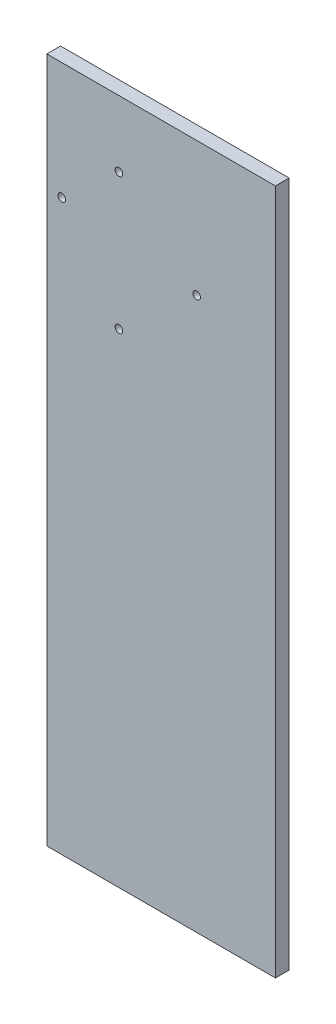
ISO-10303-21;
HEADER;
FILE_DESCRIPTION(('STEP AP214'),'2;1');
FILE_NAME('part.step','',(''),(''),'','','');
FILE_SCHEMA(('AUTOMOTIVE_DESIGN { 1 0 10303 214 1 1 1 1 }'));
ENDSEC;
DATA;
#1=APPLICATION_CONTEXT('core data for automotive mechanical design processes');
#2=APPLICATION_PROTOCOL_DEFINITION('international standard','automotive_design',2000,#1);
#3=PRODUCT_CONTEXT('',#1,'mechanical');
#4=PRODUCT('Part','Part','',(#3));
#5=PRODUCT_RELATED_PRODUCT_CATEGORY('part','',(#4));
#6=PRODUCT_DEFINITION_FORMATION('','',#4);
#7=PRODUCT_DEFINITION_CONTEXT('part definition',#1,'design');
#8=PRODUCT_DEFINITION('design','',#6,#7);
#9=PRODUCT_DEFINITION_SHAPE('','',#8);
#10=(LENGTH_UNIT() NAMED_UNIT(*) SI_UNIT(.MILLI.,.METRE.));
#11=(NAMED_UNIT(*) PLANE_ANGLE_UNIT() SI_UNIT($,.RADIAN.));
#12=(NAMED_UNIT(*) SI_UNIT($,.STERADIAN.) SOLID_ANGLE_UNIT());
#13=UNCERTAINTY_MEASURE_WITH_UNIT(LENGTH_MEASURE(1.E-05),#10,'distance_accuracy_value','');
#14=(GEOMETRIC_REPRESENTATION_CONTEXT(3) GLOBAL_UNCERTAINTY_ASSIGNED_CONTEXT((#13)) GLOBAL_UNIT_ASSIGNED_CONTEXT((#10,
#11,#12)) REPRESENTATION_CONTEXT('',''));
#15=CARTESIAN_POINT('',(0.,0.,0.));
#16=DIRECTION('',(0.,0.,1.));
#17=DIRECTION('',(1.,0.,0.));
#18=AXIS2_PLACEMENT_3D('',#15,#16,#17);
#19=CARTESIAN_POINT('',(75.0000000000001,450.,-4.50000000000001));
#20=DIRECTION('',(-1.,0.,0.));
#21=DIRECTION('',(0.,0.,1.));
#22=AXIS2_PLACEMENT_3D('',#19,#20,#21);
#23=PLANE('',#22);
#24=DIRECTION('',(0.,0.,-1.));
#25=VECTOR('',#24,1.);
#26=CARTESIAN_POINT('',(75.0000000000001,0.,-4.50000000000001));
#27=LINE('',#26,#25);
#28=CARTESIAN_POINT('',(75.0000000000001,0.,4.49999999999999));
#29=VERTEX_POINT('',#28);
#30=CARTESIAN_POINT('',(75.0000000000001,0.,-4.50000000000001));
#31=VERTEX_POINT('',#30);
#32=EDGE_CURVE('E100',#29,#31,#27,.T.);
#33=ORIENTED_EDGE('',*,*,#32,.T.);
#34=DIRECTION('',(0.,-1.,0.));
#35=VECTOR('',#34,1.);
#36=CARTESIAN_POINT('',(75.0000000000001,450.,-4.50000000000001));
#37=LINE('',#36,#35);
#38=CARTESIAN_POINT('',(75.0000000000001,450.,-4.50000000000001));
#39=VERTEX_POINT('',#38);
#40=EDGE_CURVE('E11',#39,#31,#37,.T.);
#41=ORIENTED_EDGE('',*,*,#40,.F.);
#42=DIRECTION('',(0.,0.,-1.));
#43=VECTOR('',#42,1.);
#44=CARTESIAN_POINT('',(75.0000000000001,450.,-4.50000000000001));
#45=LINE('',#44,#43);
#46=CARTESIAN_POINT('',(75.0000000000001,450.,4.49999999999999));
#47=VERTEX_POINT('',#46);
#48=EDGE_CURVE('E87',#47,#39,#45,.T.);
#49=ORIENTED_EDGE('',*,*,#48,.F.);
#50=DIRECTION('',(0.,-1.,0.));
#51=VECTOR('',#50,1.);
#52=CARTESIAN_POINT('',(75.0000000000001,450.,4.49999999999999));
#53=LINE('',#52,#51);
#54=EDGE_CURVE('E96',#47,#29,#53,.T.);
#55=ORIENTED_EDGE('',*,*,#54,.T.);
#56=EDGE_LOOP('',(#33,#41,#49,#55));
#57=FACE_BOUND('',#56,.T.);
#58=ADVANCED_FACE('F34',(#57),#23,.F.);
#59=CARTESIAN_POINT('',(-74.9999999999999,450.,-4.50000000000001));
#60=DIRECTION('',(0.,0.,1.));
#61=DIRECTION('',(1.,0.,0.));
#62=AXIS2_PLACEMENT_3D('',#59,#60,#61);
#63=PLANE('',#62);
#64=CARTESIAN_POINT('',(-27.7,406.6,-4.50000000000001));
#65=DIRECTION('',(0.,0.,1.));
#66=DIRECTION('',(1.,0.,0.));
#67=AXIS2_PLACEMENT_3D('',#64,#65,#66);
#68=CIRCLE('',#67,2.5);
#69=CARTESIAN_POINT('',(-30.2,406.6,-4.50000000000001));
#70=VERTEX_POINT('',#69);
#71=EDGE_CURVE('E112',#70,#70,#68,.F.);
#72=ORIENTED_EDGE('',*,*,#71,.F.);
#73=EDGE_LOOP('',(#72));
#74=FACE_BOUND('',#73,.T.);
#75=CARTESIAN_POINT('',(-27.7,317.4,-4.50000000000001));
#76=DIRECTION('',(0.,0.,1.));
#77=DIRECTION('',(1.,0.,0.));
#78=AXIS2_PLACEMENT_3D('',#75,#76,#77);
#79=CIRCLE('',#78,2.5);
#80=CARTESIAN_POINT('',(-30.2,317.4,-4.50000000000001));
#81=VERTEX_POINT('',#80);
#82=EDGE_CURVE('E162',#81,#81,#79,.F.);
#83=ORIENTED_EDGE('',*,*,#82,.F.);
#84=EDGE_LOOP('',(#83));
#85=FACE_BOUND('',#84,.T.);
#86=CARTESIAN_POINT('',(23.3,362.,-4.50000000000001));
#87=DIRECTION('',(0.,0.,1.));
#88=DIRECTION('',(1.,0.,0.));
#89=AXIS2_PLACEMENT_3D('',#86,#87,#88);
#90=CIRCLE('',#89,2.5);
#91=CARTESIAN_POINT('',(20.8,362.,-4.50000000000001));
#92=VERTEX_POINT('',#91);
#93=EDGE_CURVE('E159',#92,#92,#90,.F.);
#94=ORIENTED_EDGE('',*,*,#93,.F.);
#95=EDGE_LOOP('',(#94));
#96=FACE_BOUND('',#95,.T.);
#97=CARTESIAN_POINT('',(-65.1999999999999,373.3,-4.50000000000001));
#98=DIRECTION('',(0.,0.,1.));
#99=DIRECTION('',(1.,0.,0.));
#100=AXIS2_PLACEMENT_3D('',#97,#98,#99);
#101=CIRCLE('',#100,2.5);
#102=CARTESIAN_POINT('',(-67.7,373.3,-4.50000000000001));
#103=VERTEX_POINT('',#102);
#104=EDGE_CURVE('E157',#103,#103,#101,.F.);
#105=ORIENTED_EDGE('',*,*,#104,.F.);
#106=EDGE_LOOP('',(#105));
#107=FACE_BOUND('',#106,.T.);
#108=DIRECTION('',(-1.,0.,0.));
#109=VECTOR('',#108,1.);
#110=CARTESIAN_POINT('',(-74.9999999999999,0.,-4.50000000000001));
#111=LINE('',#110,#109);
#112=CARTESIAN_POINT('',(-74.9999999999999,0.,-4.50000000000001));
#113=VERTEX_POINT('',#112);
#114=EDGE_CURVE('E91',#31,#113,#111,.T.);
#115=ORIENTED_EDGE('',*,*,#114,.T.);
#116=DIRECTION('',(0.,-1.,0.));
#117=VECTOR('',#116,1.);
#118=CARTESIAN_POINT('',(-74.9999999999999,450.,-4.50000000000001));
#119=LINE('',#118,#117);
#120=CARTESIAN_POINT('',(-74.9999999999999,450.,-4.50000000000001));
#121=VERTEX_POINT('',#120);
#122=EDGE_CURVE('E43',#121,#113,#119,.T.);
#123=ORIENTED_EDGE('',*,*,#122,.F.);
#124=DIRECTION('',(-1.,0.,0.));
#125=VECTOR('',#124,1.);
#126=CARTESIAN_POINT('',(-74.9999999999999,450.,-4.50000000000001));
#127=LINE('',#126,#125);
#128=EDGE_CURVE('E82',#39,#121,#127,.T.);
#129=ORIENTED_EDGE('',*,*,#128,.F.);
#130=ORIENTED_EDGE('',*,*,#40,.T.);
#131=EDGE_LOOP('',(#115,#123,#129,#130));
#132=FACE_BOUND('',#131,.T.);
#133=ADVANCED_FACE('F90',(#74,#85,#96,#107,#132),#63,.F.);
#134=CARTESIAN_POINT('',(-74.9999999999999,450.,-4.50000000000001));
#135=DIRECTION('',(1.,0.,0.));
#136=DIRECTION('',(0.,0.,-1.));
#137=AXIS2_PLACEMENT_3D('',#134,#135,#136);
#138=PLANE('',#137);
#139=DIRECTION('',(0.,0.,1.));
#140=VECTOR('',#139,1.);
#141=CARTESIAN_POINT('',(-74.9999999999999,0.,-4.50000000000001));
#142=LINE('',#141,#140);
#143=CARTESIAN_POINT('',(-75.,0.,4.49999999999999));
#144=VERTEX_POINT('',#143);
#145=EDGE_CURVE('E69',#113,#144,#142,.T.);
#146=ORIENTED_EDGE('',*,*,#145,.T.);
#147=DIRECTION('',(0.,-1.,0.));
#148=VECTOR('',#147,1.);
#149=CARTESIAN_POINT('',(-75.,450.,4.49999999999999));
#150=LINE('',#149,#148);
#151=CARTESIAN_POINT('',(-75.,450.,4.49999999999999));
#152=VERTEX_POINT('',#151);
#153=EDGE_CURVE('E92',#152,#144,#150,.T.);
#154=ORIENTED_EDGE('',*,*,#153,.F.);
#155=DIRECTION('',(0.,0.,1.));
#156=VECTOR('',#155,1.);
#157=CARTESIAN_POINT('',(-74.9999999999999,450.,-4.50000000000001));
#158=LINE('',#157,#156);
#159=EDGE_CURVE('E85',#121,#152,#158,.T.);
#160=ORIENTED_EDGE('',*,*,#159,.F.);
#161=ORIENTED_EDGE('',*,*,#122,.T.);
#162=EDGE_LOOP('',(#146,#154,#160,#161));
#163=FACE_BOUND('',#162,.T.);
#164=ADVANCED_FACE('F94',(#163),#138,.F.);
#165=CARTESIAN_POINT('',(-75.,450.,4.49999999999999));
#166=DIRECTION('',(0.,0.,-1.));
#167=DIRECTION('',(-1.,0.,0.));
#168=AXIS2_PLACEMENT_3D('',#165,#166,#167);
#169=PLANE('',#168);
#170=CARTESIAN_POINT('',(-27.7,406.6,4.49999999999999));
#171=DIRECTION('',(0.,0.,-1.));
#172=DIRECTION('',(-1.,0.,0.));
#173=AXIS2_PLACEMENT_3D('',#170,#171,#172);
#174=CIRCLE('',#173,2.5);
#175=CARTESIAN_POINT('',(-30.2,406.6,4.49999999999999));
#176=VERTEX_POINT('',#175);
#177=EDGE_CURVE('E37',#176,#176,#174,.F.);
#178=ORIENTED_EDGE('',*,*,#177,.F.);
#179=EDGE_LOOP('',(#178));
#180=FACE_BOUND('',#179,.T.);
#181=CARTESIAN_POINT('',(-27.7,317.4,4.49999999999999));
#182=DIRECTION('',(0.,0.,-1.));
#183=DIRECTION('',(-1.,0.,0.));
#184=AXIS2_PLACEMENT_3D('',#181,#182,#183);
#185=CIRCLE('',#184,2.5);
#186=CARTESIAN_POINT('',(-30.2,317.4,4.49999999999999));
#187=VERTEX_POINT('',#186);
#188=EDGE_CURVE('E114',#187,#187,#185,.F.);
#189=ORIENTED_EDGE('',*,*,#188,.F.);
#190=EDGE_LOOP('',(#189));
#191=FACE_BOUND('',#190,.T.);
#192=CARTESIAN_POINT('',(23.3,362.,4.49999999999999));
#193=DIRECTION('',(0.,0.,-1.));
#194=DIRECTION('',(-1.,0.,0.));
#195=AXIS2_PLACEMENT_3D('',#192,#193,#194);
#196=CIRCLE('',#195,2.5);
#197=CARTESIAN_POINT('',(20.8,362.,4.49999999999999));
#198=VERTEX_POINT('',#197);
#199=EDGE_CURVE('E111',#198,#198,#196,.F.);
#200=ORIENTED_EDGE('',*,*,#199,.F.);
#201=EDGE_LOOP('',(#200));
#202=FACE_BOUND('',#201,.T.);
#203=CARTESIAN_POINT('',(-65.1999999999999,373.3,4.49999999999999));
#204=DIRECTION('',(0.,0.,-1.));
#205=DIRECTION('',(-1.,0.,0.));
#206=AXIS2_PLACEMENT_3D('',#203,#204,#205);
#207=CIRCLE('',#206,2.5);
#208=CARTESIAN_POINT('',(-67.7,373.3,4.49999999999999));
#209=VERTEX_POINT('',#208);
#210=EDGE_CURVE('E108',#209,#209,#207,.F.);
#211=ORIENTED_EDGE('',*,*,#210,.F.);
#212=EDGE_LOOP('',(#211));
#213=FACE_BOUND('',#212,.T.);
#214=DIRECTION('',(1.,0.,0.));
#215=VECTOR('',#214,1.);
#216=CARTESIAN_POINT('',(-75.,0.,4.49999999999999));
#217=LINE('',#216,#215);
#218=EDGE_CURVE('E75',#144,#29,#217,.T.);
#219=ORIENTED_EDGE('',*,*,#218,.T.);
#220=ORIENTED_EDGE('',*,*,#54,.F.);
#221=DIRECTION('',(1.,0.,0.));
#222=VECTOR('',#221,1.);
#223=CARTESIAN_POINT('',(-75.,450.,4.49999999999999));
#224=LINE('',#223,#222);
#225=EDGE_CURVE('E52',#152,#47,#224,.T.);
#226=ORIENTED_EDGE('',*,*,#225,.F.);
#227=ORIENTED_EDGE('',*,*,#153,.T.);
#228=EDGE_LOOP('',(#219,#220,#226,#227));
#229=FACE_BOUND('',#228,.T.);
#230=ADVANCED_FACE('F123',(#180,#191,#202,#213,#229),#169,.F.);
#231=CARTESIAN_POINT('',(0.,450.,0.));
#232=DIRECTION('',(0.,1.,0.));
#233=DIRECTION('',(0.,0.,1.));
#234=AXIS2_PLACEMENT_3D('',#231,#232,#233);
#235=PLANE('',#234);
#236=ORIENTED_EDGE('',*,*,#48,.T.);
#237=ORIENTED_EDGE('',*,*,#128,.T.);
#238=ORIENTED_EDGE('',*,*,#159,.T.);
#239=ORIENTED_EDGE('',*,*,#225,.T.);
#240=EDGE_LOOP('',(#236,#237,#238,#239));
#241=FACE_BOUND('',#240,.T.);
#242=ADVANCED_FACE('F83',(#241),#235,.T.);
#243=CARTESIAN_POINT('',(0.,0.,0.));
#244=DIRECTION('',(0.,1.,0.));
#245=DIRECTION('',(0.,0.,1.));
#246=AXIS2_PLACEMENT_3D('',#243,#244,#245);
#247=PLANE('',#246);
#248=ORIENTED_EDGE('',*,*,#32,.F.);
#249=ORIENTED_EDGE('',*,*,#218,.F.);
#250=ORIENTED_EDGE('',*,*,#145,.F.);
#251=ORIENTED_EDGE('',*,*,#114,.F.);
#252=EDGE_LOOP('',(#248,#249,#250,#251));
#253=FACE_BOUND('',#252,.T.);
#254=ADVANCED_FACE('F135',(#253),#247,.F.);
#255=CARTESIAN_POINT('',(-65.1999999999999,373.3,4.50001199999999));
#256=DIRECTION('',(0.,0.,-1.));
#257=DIRECTION('',(-1.,0.,0.));
#258=AXIS2_PLACEMENT_3D('',#255,#256,#257);
#259=CYLINDRICAL_SURFACE('',#258,2.5);
#260=CARTESIAN_POINT('',(-67.7,373.3,-4.50000000000001));
#261=CARTESIAN_POINT('',(-67.7,373.3,-4.40625000000001));
#262=CARTESIAN_POINT('',(-67.7,373.3,-4.31250000000001));
#263=CARTESIAN_POINT('',(-67.7,373.3,-4.12500000000001));
#264=CARTESIAN_POINT('',(-67.7,373.3,-4.03125000000001));
#265=CARTESIAN_POINT('',(-67.7,373.3,-3.84375000000001));
#266=CARTESIAN_POINT('',(-67.7,373.3,-3.75000000000001));
#267=CARTESIAN_POINT('',(-67.7,373.3,-3.56250000000001));
#268=CARTESIAN_POINT('',(-67.7,373.3,-3.46875000000001));
#269=CARTESIAN_POINT('',(-67.7,373.3,-3.28125000000001));
#270=CARTESIAN_POINT('',(-67.7,373.3,-3.18750000000001));
#271=CARTESIAN_POINT('',(-67.7,373.3,-3.00000000000001));
#272=CARTESIAN_POINT('',(-67.7,373.3,-2.90625000000001));
#273=CARTESIAN_POINT('',(-67.7,373.3,-2.71875000000001));
#274=CARTESIAN_POINT('',(-67.7,373.3,-2.62500000000001));
#275=CARTESIAN_POINT('',(-67.7,373.3,-2.43750000000001));
#276=CARTESIAN_POINT('',(-67.7,373.3,-2.34375000000001));
#277=CARTESIAN_POINT('',(-67.7,373.3,-2.15625000000001));
#278=CARTESIAN_POINT('',(-67.7,373.3,-2.06250000000001));
#279=CARTESIAN_POINT('',(-67.7,373.3,-1.87500000000001));
#280=CARTESIAN_POINT('',(-67.7,373.3,-1.78125000000001));
#281=CARTESIAN_POINT('',(-67.7,373.3,-1.59375000000001));
#282=CARTESIAN_POINT('',(-67.7,373.3,-1.50000000000001));
#283=CARTESIAN_POINT('',(-67.7,373.3,-1.31250000000001));
#284=CARTESIAN_POINT('',(-67.7,373.3,-1.21875000000001));
#285=CARTESIAN_POINT('',(-67.7,373.3,-1.03125000000001));
#286=CARTESIAN_POINT('',(-67.7,373.3,-0.937500000000006));
#287=CARTESIAN_POINT('',(-67.7,373.3,-0.750000000000006));
#288=CARTESIAN_POINT('',(-67.7,373.3,-0.656250000000006));
#289=CARTESIAN_POINT('',(-67.7,373.3,-0.468750000000006));
#290=CARTESIAN_POINT('',(-67.7,373.3,-0.375000000000006));
#291=CARTESIAN_POINT('',(-67.7,373.3,-0.187500000000006));
#292=CARTESIAN_POINT('',(-67.7,373.3,-0.0937500000000062));
#293=CARTESIAN_POINT('',(-67.7,373.3,0.093749999999994));
#294=CARTESIAN_POINT('',(-67.7,373.3,0.187499999999994));
#295=CARTESIAN_POINT('',(-67.7,373.3,0.374999999999994));
#296=CARTESIAN_POINT('',(-67.7,373.3,0.468749999999994));
#297=CARTESIAN_POINT('',(-67.7,373.3,0.656249999999994));
#298=CARTESIAN_POINT('',(-67.7,373.3,0.749999999999994));
#299=CARTESIAN_POINT('',(-67.7,373.3,0.937499999999993));
#300=CARTESIAN_POINT('',(-67.7,373.3,1.03124999999999));
#301=CARTESIAN_POINT('',(-67.7,373.3,1.21874999999999));
#302=CARTESIAN_POINT('',(-67.7,373.3,1.31249999999999));
#303=CARTESIAN_POINT('',(-67.7,373.3,1.49999999999999));
#304=CARTESIAN_POINT('',(-67.7,373.3,1.59374999999999));
#305=CARTESIAN_POINT('',(-67.7,373.3,1.78124999999999));
#306=CARTESIAN_POINT('',(-67.7,373.3,1.87499999999999));
#307=CARTESIAN_POINT('',(-67.7,373.3,2.06249999999999));
#308=CARTESIAN_POINT('',(-67.7,373.3,2.15624999999999));
#309=CARTESIAN_POINT('',(-67.7,373.3,2.34374999999999));
#310=CARTESIAN_POINT('',(-67.7,373.3,2.43749999999999));
#311=CARTESIAN_POINT('',(-67.7,373.3,2.62499999999999));
#312=CARTESIAN_POINT('',(-67.7,373.3,2.71874999999999));
#313=CARTESIAN_POINT('',(-67.7,373.3,2.90624999999999));
#314=CARTESIAN_POINT('',(-67.7,373.3,2.99999999999999));
#315=CARTESIAN_POINT('',(-67.7,373.3,3.18749999999999));
#316=CARTESIAN_POINT('',(-67.7,373.3,3.28124999999999));
#317=CARTESIAN_POINT('',(-67.7,373.3,3.46874999999999));
#318=CARTESIAN_POINT('',(-67.7,373.3,3.56249999999999));
#319=CARTESIAN_POINT('',(-67.7,373.3,3.74999999999999));
#320=CARTESIAN_POINT('',(-67.7,373.3,3.84374999999999));
#321=CARTESIAN_POINT('',(-67.7,373.3,4.03124999999999));
#322=CARTESIAN_POINT('',(-67.7,373.3,4.12499999999999));
#323=CARTESIAN_POINT('',(-67.7,373.3,4.31249999999999));
#324=CARTESIAN_POINT('',(-67.7,373.3,4.40624999999999));
#325=CARTESIAN_POINT('',(-67.7,373.3,4.49999999999999));
#326=B_SPLINE_CURVE_WITH_KNOTS('',3,(#260,#261,#262,#263,#264,#265,#266,#267,#268,#269,#270,
#271,#272,#273,#274,#275,#276,#277,#278,#279,#280,#281,#282,#283,#284,#285,#286,#287,#288,#289,
#290,#291,#292,#293,#294,#295,#296,#297,#298,#299,#300,#301,#302,#303,#304,#305,#306,#307,#308,
#309,#310,#311,#312,#313,#314,#315,#316,#317,#318,#319,#320,#321,#322,#323,#324,#325),
.UNSPECIFIED.,.F.,.F.,(4,2,2,2,2,2,2,2,2,2,2,2,2,2,2,2,2,2,2,2,2,2,2,2,2,2,2,2,2,2,2,2,4),(0.,
0.28125,0.5625,0.843750000000001,1.125,1.40625,1.6875,1.96875,2.25,2.53125,2.8125,3.09375,3.375,
3.65625,3.9375,4.21875,4.5,4.78125,5.0625,5.34375,5.625,5.90625,6.1875,6.46875,6.75,7.03125,
7.3125,7.59375,7.875,8.15625,8.4375,8.71875,9.),.UNSPECIFIED.);
#327=EDGE_CURVE('BSEAM132',#103,#209,#326,.T.);
#328=ORIENTED_EDGE('',*,*,#104,.T.);
#329=ORIENTED_EDGE('',*,*,#210,.T.);
#330=ORIENTED_EDGE('',*,*,#327,.T.);
#331=ORIENTED_EDGE('',*,*,#327,.F.);
#332=EDGE_LOOP('',(#328,#330,#329,#331));
#333=FACE_BOUND('',#332,.T.);
#334=ADVANCED_FACE('F132',(#333),#259,.F.);
#335=CARTESIAN_POINT('',(23.3,362.,4.50001199999999));
#336=DIRECTION('',(0.,0.,-1.));
#337=DIRECTION('',(-1.,0.,0.));
#338=AXIS2_PLACEMENT_3D('',#335,#336,#337);
#339=CYLINDRICAL_SURFACE('',#338,2.5);
#340=CARTESIAN_POINT('',(20.8,362.,-4.50000000000001));
#341=CARTESIAN_POINT('',(20.8,362.,-4.40625000000001));
#342=CARTESIAN_POINT('',(20.8,362.,-4.31250000000001));
#343=CARTESIAN_POINT('',(20.8,362.,-4.12500000000001));
#344=CARTESIAN_POINT('',(20.8,362.,-4.03125000000001));
#345=CARTESIAN_POINT('',(20.8,362.,-3.84375000000001));
#346=CARTESIAN_POINT('',(20.8,362.,-3.75000000000001));
#347=CARTESIAN_POINT('',(20.8,362.,-3.56250000000001));
#348=CARTESIAN_POINT('',(20.8,362.,-3.46875000000001));
#349=CARTESIAN_POINT('',(20.8,362.,-3.28125000000001));
#350=CARTESIAN_POINT('',(20.8,362.,-3.18750000000001));
#351=CARTESIAN_POINT('',(20.8,362.,-3.00000000000001));
#352=CARTESIAN_POINT('',(20.8,362.,-2.90625000000001));
#353=CARTESIAN_POINT('',(20.8,362.,-2.71875000000001));
#354=CARTESIAN_POINT('',(20.8,362.,-2.62500000000001));
#355=CARTESIAN_POINT('',(20.8,362.,-2.43750000000001));
#356=CARTESIAN_POINT('',(20.8,362.,-2.34375000000001));
#357=CARTESIAN_POINT('',(20.8,362.,-2.15625000000001));
#358=CARTESIAN_POINT('',(20.8,362.,-2.06250000000001));
#359=CARTESIAN_POINT('',(20.8,362.,-1.87500000000001));
#360=CARTESIAN_POINT('',(20.8,362.,-1.78125000000001));
#361=CARTESIAN_POINT('',(20.8,362.,-1.59375000000001));
#362=CARTESIAN_POINT('',(20.8,362.,-1.50000000000001));
#363=CARTESIAN_POINT('',(20.8,362.,-1.31250000000001));
#364=CARTESIAN_POINT('',(20.8,362.,-1.21875000000001));
#365=CARTESIAN_POINT('',(20.8,362.,-1.03125000000001));
#366=CARTESIAN_POINT('',(20.8,362.,-0.937500000000006));
#367=CARTESIAN_POINT('',(20.8,362.,-0.750000000000006));
#368=CARTESIAN_POINT('',(20.8,362.,-0.656250000000006));
#369=CARTESIAN_POINT('',(20.8,362.,-0.468750000000006));
#370=CARTESIAN_POINT('',(20.8,362.,-0.375000000000006));
#371=CARTESIAN_POINT('',(20.8,362.,-0.187500000000006));
#372=CARTESIAN_POINT('',(20.8,362.,-0.0937500000000062));
#373=CARTESIAN_POINT('',(20.8,362.,0.093749999999994));
#374=CARTESIAN_POINT('',(20.8,362.,0.187499999999994));
#375=CARTESIAN_POINT('',(20.8,362.,0.374999999999994));
#376=CARTESIAN_POINT('',(20.8,362.,0.468749999999994));
#377=CARTESIAN_POINT('',(20.8,362.,0.656249999999994));
#378=CARTESIAN_POINT('',(20.8,362.,0.749999999999994));
#379=CARTESIAN_POINT('',(20.8,362.,0.937499999999993));
#380=CARTESIAN_POINT('',(20.8,362.,1.03124999999999));
#381=CARTESIAN_POINT('',(20.8,362.,1.21874999999999));
#382=CARTESIAN_POINT('',(20.8,362.,1.31249999999999));
#383=CARTESIAN_POINT('',(20.8,362.,1.49999999999999));
#384=CARTESIAN_POINT('',(20.8,362.,1.59374999999999));
#385=CARTESIAN_POINT('',(20.8,362.,1.78124999999999));
#386=CARTESIAN_POINT('',(20.8,362.,1.87499999999999));
#387=CARTESIAN_POINT('',(20.8,362.,2.06249999999999));
#388=CARTESIAN_POINT('',(20.8,362.,2.15624999999999));
#389=CARTESIAN_POINT('',(20.8,362.,2.34374999999999));
#390=CARTESIAN_POINT('',(20.8,362.,2.43749999999999));
#391=CARTESIAN_POINT('',(20.8,362.,2.62499999999999));
#392=CARTESIAN_POINT('',(20.8,362.,2.71874999999999));
#393=CARTESIAN_POINT('',(20.8,362.,2.90624999999999));
#394=CARTESIAN_POINT('',(20.8,362.,2.99999999999999));
#395=CARTESIAN_POINT('',(20.8,362.,3.18749999999999));
#396=CARTESIAN_POINT('',(20.8,362.,3.28124999999999));
#397=CARTESIAN_POINT('',(20.8,362.,3.46874999999999));
#398=CARTESIAN_POINT('',(20.8,362.,3.56249999999999));
#399=CARTESIAN_POINT('',(20.8,362.,3.74999999999999));
#400=CARTESIAN_POINT('',(20.8,362.,3.84374999999999));
#401=CARTESIAN_POINT('',(20.8,362.,4.03124999999999));
#402=CARTESIAN_POINT('',(20.8,362.,4.12499999999999));
#403=CARTESIAN_POINT('',(20.8,362.,4.31249999999999));
#404=CARTESIAN_POINT('',(20.8,362.,4.40624999999999));
#405=CARTESIAN_POINT('',(20.8,362.,4.49999999999999));
#406=B_SPLINE_CURVE_WITH_KNOTS('',3,(#340,#341,#342,#343,#344,#345,#346,#347,#348,#349,#350,
#351,#352,#353,#354,#355,#356,#357,#358,#359,#360,#361,#362,#363,#364,#365,#366,#367,#368,#369,
#370,#371,#372,#373,#374,#375,#376,#377,#378,#379,#380,#381,#382,#383,#384,#385,#386,#387,#388,
#389,#390,#391,#392,#393,#394,#395,#396,#397,#398,#399,#400,#401,#402,#403,#404,#405),
.UNSPECIFIED.,.F.,.F.,(4,2,2,2,2,2,2,2,2,2,2,2,2,2,2,2,2,2,2,2,2,2,2,2,2,2,2,2,2,2,2,2,4),(0.,
0.28125,0.5625,0.843750000000001,1.125,1.40625,1.6875,1.96875,2.25,2.53125,2.8125,3.09375,3.375,
3.65625,3.9375,4.21875,4.5,4.78125,5.0625,5.34375,5.625,5.90625,6.1875,6.46875,6.75,7.03125,
7.3125,7.59375,7.875,8.15625,8.4375,8.71875,9.),.UNSPECIFIED.);
#407=EDGE_CURVE('BSEAM134',#92,#198,#406,.T.);
#408=ORIENTED_EDGE('',*,*,#93,.T.);
#409=ORIENTED_EDGE('',*,*,#199,.T.);
#410=ORIENTED_EDGE('',*,*,#407,.T.);
#411=ORIENTED_EDGE('',*,*,#407,.F.);
#412=EDGE_LOOP('',(#408,#410,#409,#411));
#413=FACE_BOUND('',#412,.T.);
#414=ADVANCED_FACE('F134',(#413),#339,.F.);
#415=CARTESIAN_POINT('',(-27.7,317.4,4.50001199999999));
#416=DIRECTION('',(0.,0.,-1.));
#417=DIRECTION('',(-1.,0.,0.));
#418=AXIS2_PLACEMENT_3D('',#415,#416,#417);
#419=CYLINDRICAL_SURFACE('',#418,2.5);
#420=CARTESIAN_POINT('',(-30.2,317.4,-4.50000000000001));
#421=CARTESIAN_POINT('',(-30.2,317.4,-4.40625000000001));
#422=CARTESIAN_POINT('',(-30.2,317.4,-4.31250000000001));
#423=CARTESIAN_POINT('',(-30.2,317.4,-4.12500000000001));
#424=CARTESIAN_POINT('',(-30.2,317.4,-4.03125000000001));
#425=CARTESIAN_POINT('',(-30.2,317.4,-3.84375000000001));
#426=CARTESIAN_POINT('',(-30.2,317.4,-3.75000000000001));
#427=CARTESIAN_POINT('',(-30.2,317.4,-3.56250000000001));
#428=CARTESIAN_POINT('',(-30.2,317.4,-3.46875000000001));
#429=CARTESIAN_POINT('',(-30.2,317.4,-3.28125000000001));
#430=CARTESIAN_POINT('',(-30.2,317.4,-3.18750000000001));
#431=CARTESIAN_POINT('',(-30.2,317.4,-3.00000000000001));
#432=CARTESIAN_POINT('',(-30.2,317.4,-2.90625000000001));
#433=CARTESIAN_POINT('',(-30.2,317.4,-2.71875000000001));
#434=CARTESIAN_POINT('',(-30.2,317.4,-2.62500000000001));
#435=CARTESIAN_POINT('',(-30.2,317.4,-2.43750000000001));
#436=CARTESIAN_POINT('',(-30.2,317.4,-2.34375000000001));
#437=CARTESIAN_POINT('',(-30.2,317.4,-2.15625000000001));
#438=CARTESIAN_POINT('',(-30.2,317.4,-2.06250000000001));
#439=CARTESIAN_POINT('',(-30.2,317.4,-1.87500000000001));
#440=CARTESIAN_POINT('',(-30.2,317.4,-1.78125000000001));
#441=CARTESIAN_POINT('',(-30.2,317.4,-1.59375000000001));
#442=CARTESIAN_POINT('',(-30.2,317.4,-1.50000000000001));
#443=CARTESIAN_POINT('',(-30.2,317.4,-1.31250000000001));
#444=CARTESIAN_POINT('',(-30.2,317.4,-1.21875000000001));
#445=CARTESIAN_POINT('',(-30.2,317.4,-1.03125000000001));
#446=CARTESIAN_POINT('',(-30.2,317.4,-0.937500000000006));
#447=CARTESIAN_POINT('',(-30.2,317.4,-0.750000000000006));
#448=CARTESIAN_POINT('',(-30.2,317.4,-0.656250000000006));
#449=CARTESIAN_POINT('',(-30.2,317.4,-0.468750000000006));
#450=CARTESIAN_POINT('',(-30.2,317.4,-0.375000000000006));
#451=CARTESIAN_POINT('',(-30.2,317.4,-0.187500000000006));
#452=CARTESIAN_POINT('',(-30.2,317.4,-0.0937500000000062));
#453=CARTESIAN_POINT('',(-30.2,317.4,0.093749999999994));
#454=CARTESIAN_POINT('',(-30.2,317.4,0.187499999999994));
#455=CARTESIAN_POINT('',(-30.2,317.4,0.374999999999994));
#456=CARTESIAN_POINT('',(-30.2,317.4,0.468749999999994));
#457=CARTESIAN_POINT('',(-30.2,317.4,0.656249999999994));
#458=CARTESIAN_POINT('',(-30.2,317.4,0.749999999999994));
#459=CARTESIAN_POINT('',(-30.2,317.4,0.937499999999993));
#460=CARTESIAN_POINT('',(-30.2,317.4,1.03124999999999));
#461=CARTESIAN_POINT('',(-30.2,317.4,1.21874999999999));
#462=CARTESIAN_POINT('',(-30.2,317.4,1.31249999999999));
#463=CARTESIAN_POINT('',(-30.2,317.4,1.49999999999999));
#464=CARTESIAN_POINT('',(-30.2,317.4,1.59374999999999));
#465=CARTESIAN_POINT('',(-30.2,317.4,1.78124999999999));
#466=CARTESIAN_POINT('',(-30.2,317.4,1.87499999999999));
#467=CARTESIAN_POINT('',(-30.2,317.4,2.06249999999999));
#468=CARTESIAN_POINT('',(-30.2,317.4,2.15624999999999));
#469=CARTESIAN_POINT('',(-30.2,317.4,2.34374999999999));
#470=CARTESIAN_POINT('',(-30.2,317.4,2.43749999999999));
#471=CARTESIAN_POINT('',(-30.2,317.4,2.62499999999999));
#472=CARTESIAN_POINT('',(-30.2,317.4,2.71874999999999));
#473=CARTESIAN_POINT('',(-30.2,317.4,2.90624999999999));
#474=CARTESIAN_POINT('',(-30.2,317.4,2.99999999999999));
#475=CARTESIAN_POINT('',(-30.2,317.4,3.18749999999999));
#476=CARTESIAN_POINT('',(-30.2,317.4,3.28124999999999));
#477=CARTESIAN_POINT('',(-30.2,317.4,3.46874999999999));
#478=CARTESIAN_POINT('',(-30.2,317.4,3.56249999999999));
#479=CARTESIAN_POINT('',(-30.2,317.4,3.74999999999999));
#480=CARTESIAN_POINT('',(-30.2,317.4,3.84374999999999));
#481=CARTESIAN_POINT('',(-30.2,317.4,4.03124999999999));
#482=CARTESIAN_POINT('',(-30.2,317.4,4.12499999999999));
#483=CARTESIAN_POINT('',(-30.2,317.4,4.31249999999999));
#484=CARTESIAN_POINT('',(-30.2,317.4,4.40624999999999));
#485=CARTESIAN_POINT('',(-30.2,317.4,4.49999999999999));
#486=B_SPLINE_CURVE_WITH_KNOTS('',3,(#420,#421,#422,#423,#424,#425,#426,#427,#428,#429,#430,
#431,#432,#433,#434,#435,#436,#437,#438,#439,#440,#441,#442,#443,#444,#445,#446,#447,#448,#449,
#450,#451,#452,#453,#454,#455,#456,#457,#458,#459,#460,#461,#462,#463,#464,#465,#466,#467,#468,
#469,#470,#471,#472,#473,#474,#475,#476,#477,#478,#479,#480,#481,#482,#483,#484,#485),
.UNSPECIFIED.,.F.,.F.,(4,2,2,2,2,2,2,2,2,2,2,2,2,2,2,2,2,2,2,2,2,2,2,2,2,2,2,2,2,2,2,2,4),(0.,
0.28125,0.5625,0.843750000000001,1.125,1.40625,1.6875,1.96875,2.25,2.53125,2.8125,3.09375,3.375,
3.65625,3.9375,4.21875,4.5,4.78125,5.0625,5.34375,5.625,5.90625,6.1875,6.46875,6.75,7.03125,
7.3125,7.59375,7.875,8.15625,8.4375,8.71875,9.),.UNSPECIFIED.);
#487=EDGE_CURVE('BSEAM142',#81,#187,#486,.T.);
#488=ORIENTED_EDGE('',*,*,#82,.T.);
#489=ORIENTED_EDGE('',*,*,#188,.T.);
#490=ORIENTED_EDGE('',*,*,#487,.T.);
#491=ORIENTED_EDGE('',*,*,#487,.F.);
#492=EDGE_LOOP('',(#488,#490,#489,#491));
#493=FACE_BOUND('',#492,.T.);
#494=ADVANCED_FACE('F142',(#493),#419,.F.);
#495=CARTESIAN_POINT('',(-27.7,406.6,4.50001199999999));
#496=DIRECTION('',(0.,0.,-1.));
#497=DIRECTION('',(-1.,0.,0.));
#498=AXIS2_PLACEMENT_3D('',#495,#496,#497);
#499=CYLINDRICAL_SURFACE('',#498,2.5);
#500=CARTESIAN_POINT('',(-30.2,406.6,-4.50000000000001));
#501=CARTESIAN_POINT('',(-30.2,406.6,-4.40625000000001));
#502=CARTESIAN_POINT('',(-30.2,406.6,-4.31250000000001));
#503=CARTESIAN_POINT('',(-30.2,406.6,-4.12500000000001));
#504=CARTESIAN_POINT('',(-30.2,406.6,-4.03125000000001));
#505=CARTESIAN_POINT('',(-30.2,406.6,-3.84375000000001));
#506=CARTESIAN_POINT('',(-30.2,406.6,-3.75000000000001));
#507=CARTESIAN_POINT('',(-30.2,406.6,-3.56250000000001));
#508=CARTESIAN_POINT('',(-30.2,406.6,-3.46875000000001));
#509=CARTESIAN_POINT('',(-30.2,406.6,-3.28125000000001));
#510=CARTESIAN_POINT('',(-30.2,406.6,-3.18750000000001));
#511=CARTESIAN_POINT('',(-30.2,406.6,-3.00000000000001));
#512=CARTESIAN_POINT('',(-30.2,406.6,-2.90625000000001));
#513=CARTESIAN_POINT('',(-30.2,406.6,-2.71875000000001));
#514=CARTESIAN_POINT('',(-30.2,406.6,-2.62500000000001));
#515=CARTESIAN_POINT('',(-30.2,406.6,-2.43750000000001));
#516=CARTESIAN_POINT('',(-30.2,406.6,-2.34375000000001));
#517=CARTESIAN_POINT('',(-30.2,406.6,-2.15625000000001));
#518=CARTESIAN_POINT('',(-30.2,406.6,-2.06250000000001));
#519=CARTESIAN_POINT('',(-30.2,406.6,-1.87500000000001));
#520=CARTESIAN_POINT('',(-30.2,406.6,-1.78125000000001));
#521=CARTESIAN_POINT('',(-30.2,406.6,-1.59375000000001));
#522=CARTESIAN_POINT('',(-30.2,406.6,-1.50000000000001));
#523=CARTESIAN_POINT('',(-30.2,406.6,-1.31250000000001));
#524=CARTESIAN_POINT('',(-30.2,406.6,-1.21875000000001));
#525=CARTESIAN_POINT('',(-30.2,406.6,-1.03125000000001));
#526=CARTESIAN_POINT('',(-30.2,406.6,-0.937500000000006));
#527=CARTESIAN_POINT('',(-30.2,406.6,-0.750000000000006));
#528=CARTESIAN_POINT('',(-30.2,406.6,-0.656250000000006));
#529=CARTESIAN_POINT('',(-30.2,406.6,-0.468750000000006));
#530=CARTESIAN_POINT('',(-30.2,406.6,-0.375000000000006));
#531=CARTESIAN_POINT('',(-30.2,406.6,-0.187500000000006));
#532=CARTESIAN_POINT('',(-30.2,406.6,-0.0937500000000062));
#533=CARTESIAN_POINT('',(-30.2,406.6,0.093749999999994));
#534=CARTESIAN_POINT('',(-30.2,406.6,0.187499999999994));
#535=CARTESIAN_POINT('',(-30.2,406.6,0.374999999999994));
#536=CARTESIAN_POINT('',(-30.2,406.6,0.468749999999994));
#537=CARTESIAN_POINT('',(-30.2,406.6,0.656249999999994));
#538=CARTESIAN_POINT('',(-30.2,406.6,0.749999999999994));
#539=CARTESIAN_POINT('',(-30.2,406.6,0.937499999999993));
#540=CARTESIAN_POINT('',(-30.2,406.6,1.03124999999999));
#541=CARTESIAN_POINT('',(-30.2,406.6,1.21874999999999));
#542=CARTESIAN_POINT('',(-30.2,406.6,1.31249999999999));
#543=CARTESIAN_POINT('',(-30.2,406.6,1.49999999999999));
#544=CARTESIAN_POINT('',(-30.2,406.6,1.59374999999999));
#545=CARTESIAN_POINT('',(-30.2,406.6,1.78124999999999));
#546=CARTESIAN_POINT('',(-30.2,406.6,1.87499999999999));
#547=CARTESIAN_POINT('',(-30.2,406.6,2.06249999999999));
#548=CARTESIAN_POINT('',(-30.2,406.6,2.15624999999999));
#549=CARTESIAN_POINT('',(-30.2,406.6,2.34374999999999));
#550=CARTESIAN_POINT('',(-30.2,406.6,2.43749999999999));
#551=CARTESIAN_POINT('',(-30.2,406.6,2.62499999999999));
#552=CARTESIAN_POINT('',(-30.2,406.6,2.71874999999999));
#553=CARTESIAN_POINT('',(-30.2,406.6,2.90624999999999));
#554=CARTESIAN_POINT('',(-30.2,406.6,2.99999999999999));
#555=CARTESIAN_POINT('',(-30.2,406.6,3.18749999999999));
#556=CARTESIAN_POINT('',(-30.2,406.6,3.28124999999999));
#557=CARTESIAN_POINT('',(-30.2,406.6,3.46874999999999));
#558=CARTESIAN_POINT('',(-30.2,406.6,3.56249999999999));
#559=CARTESIAN_POINT('',(-30.2,406.6,3.74999999999999));
#560=CARTESIAN_POINT('',(-30.2,406.6,3.84374999999999));
#561=CARTESIAN_POINT('',(-30.2,406.6,4.03124999999999));
#562=CARTESIAN_POINT('',(-30.2,406.6,4.12499999999999));
#563=CARTESIAN_POINT('',(-30.2,406.6,4.31249999999999));
#564=CARTESIAN_POINT('',(-30.2,406.6,4.40624999999999));
#565=CARTESIAN_POINT('',(-30.2,406.6,4.49999999999999));
#566=B_SPLINE_CURVE_WITH_KNOTS('',3,(#500,#501,#502,#503,#504,#505,#506,#507,#508,#509,#510,
#511,#512,#513,#514,#515,#516,#517,#518,#519,#520,#521,#522,#523,#524,#525,#526,#527,#528,#529,
#530,#531,#532,#533,#534,#535,#536,#537,#538,#539,#540,#541,#542,#543,#544,#545,#546,#547,#548,
#549,#550,#551,#552,#553,#554,#555,#556,#557,#558,#559,#560,#561,#562,#563,#564,#565),
.UNSPECIFIED.,.F.,.F.,(4,2,2,2,2,2,2,2,2,2,2,2,2,2,2,2,2,2,2,2,2,2,2,2,2,2,2,2,2,2,2,2,4),(0.,
0.28125,0.5625,0.843750000000001,1.125,1.40625,1.6875,1.96875,2.25,2.53125,2.8125,3.09375,3.375,
3.65625,3.9375,4.21875,4.5,4.78125,5.0625,5.34375,5.625,5.90625,6.1875,6.46875,6.75,7.03125,
7.3125,7.59375,7.875,8.15625,8.4375,8.71875,9.),.UNSPECIFIED.);
#567=EDGE_CURVE('BSEAM121',#70,#176,#566,.T.);
#568=ORIENTED_EDGE('',*,*,#71,.T.);
#569=ORIENTED_EDGE('',*,*,#177,.T.);
#570=ORIENTED_EDGE('',*,*,#567,.T.);
#571=ORIENTED_EDGE('',*,*,#567,.F.);
#572=EDGE_LOOP('',(#568,#570,#569,#571));
#573=FACE_BOUND('',#572,.T.);
#574=ADVANCED_FACE('F121',(#573),#499,.F.);
#575=CLOSED_SHELL('',(#58,#133,#164,#230,#242,#254,#334,#414,#494,#574));
#576=MANIFOLD_SOLID_BREP('B2',#575);
#577=ADVANCED_BREP_SHAPE_REPRESENTATION('',(#18,#576),#14);
#578=SHAPE_DEFINITION_REPRESENTATION(#9,#577);
ENDSEC;
END-ISO-10303-21;
